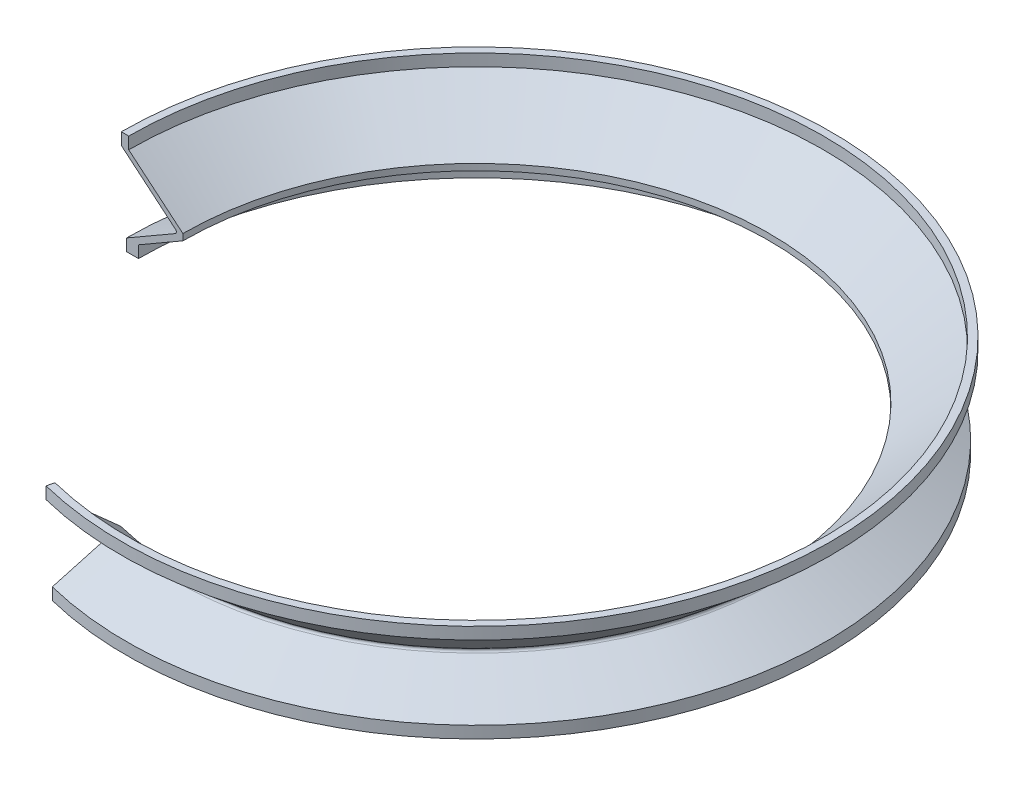
ISO-10303-21;
HEADER;
FILE_DESCRIPTION(('STEP AP214'),'2;1');
FILE_NAME('part.step','',(''),(''),'','','');
FILE_SCHEMA(('AUTOMOTIVE_DESIGN { 1 0 10303 214 1 1 1 1 }'));
ENDSEC;
DATA;
#1=APPLICATION_CONTEXT('core data for automotive mechanical design processes');
#2=APPLICATION_PROTOCOL_DEFINITION('international standard','automotive_design',2000,#1);
#3=PRODUCT_CONTEXT('',#1,'mechanical');
#4=PRODUCT('Part','Part','',(#3));
#5=PRODUCT_RELATED_PRODUCT_CATEGORY('part','',(#4));
#6=PRODUCT_DEFINITION_FORMATION('','',#4);
#7=PRODUCT_DEFINITION_CONTEXT('part definition',#1,'design');
#8=PRODUCT_DEFINITION('design','',#6,#7);
#9=PRODUCT_DEFINITION_SHAPE('','',#8);
#10=(LENGTH_UNIT() NAMED_UNIT(*) SI_UNIT(.MILLI.,.METRE.));
#11=(NAMED_UNIT(*) PLANE_ANGLE_UNIT() SI_UNIT($,.RADIAN.));
#12=(NAMED_UNIT(*) SI_UNIT($,.STERADIAN.) SOLID_ANGLE_UNIT());
#13=UNCERTAINTY_MEASURE_WITH_UNIT(LENGTH_MEASURE(1.E-05),#10,'distance_accuracy_value','');
#14=(GEOMETRIC_REPRESENTATION_CONTEXT(3) GLOBAL_UNCERTAINTY_ASSIGNED_CONTEXT((#13)) GLOBAL_UNIT_ASSIGNED_CONTEXT((#10,
#11,#12)) REPRESENTATION_CONTEXT('',''));
#15=CARTESIAN_POINT('',(0.,0.,0.));
#16=DIRECTION('',(0.,0.,1.));
#17=DIRECTION('',(1.,0.,0.));
#18=AXIS2_PLACEMENT_3D('',#15,#16,#17);
#19=CARTESIAN_POINT('',(50.6987532118802,0.,0.));
#20=DIRECTION('',(0.,-1.,0.));
#21=DIRECTION('',(0.,0.,-1.));
#22=AXIS2_PLACEMENT_3D('',#19,#20,#21);
#23=CONICAL_SURFACE('',#22,50.0359712592462,1.0471975511966);
#24=DIRECTION('',(-0.866025403784442,-0.499999999999995,0.));
#25=VECTOR('',#24,1.);
#26=CARTESIAN_POINT('',(0.662781952633966,0.,0.));
#27=LINE('',#26,#25);
#28=CARTESIAN_POINT('',(0.168056970952835,-0.28562960134843,0.));
#29=VERTEX_POINT('',#28);
#30=CARTESIAN_POINT('',(-7.99747208521054,-5.,0.));
#31=VERTEX_POINT('',#30);
#32=EDGE_CURVE('E191',#29,#31,#27,.T.);
#33=ORIENTED_EDGE('',*,*,#32,.F.);
#34=CARTESIAN_POINT('',(50.6987532118802,-0.285629601348425,0.));
#35=DIRECTION('',(0.,-1.,0.));
#36=DIRECTION('',(0.,0.,-1.));
#37=AXIS2_PLACEMENT_3D('',#34,#35,#36);
#38=CIRCLE('',#37,50.5306962409273);
#39=CARTESIAN_POINT('',(38.4742713913035,-0.285629601348429,49.0297186083222));
#40=VERTEX_POINT('',#39);
#41=EDGE_CURVE('E67',#29,#40,#38,.T.);
#42=ORIENTED_EDGE('',*,*,#41,.T.);
#43=DIRECTION('',(-0.209510507321009,-0.499999999999995,0.840300748138485));
#44=VECTOR('',#43,1.);
#45=CARTESIAN_POINT('',(38.5939561966723,0.,48.549689072915));
#46=LINE('',#45,#44);
#47=CARTESIAN_POINT('',(36.4988511234622,-5.,56.9526965543));
#48=VERTEX_POINT('',#47);
#49=EDGE_CURVE('E209',#40,#48,#46,.T.);
#50=ORIENTED_EDGE('',*,*,#49,.T.);
#51=CARTESIAN_POINT('',(50.6987532118802,-5.,0.));
#52=DIRECTION('',(0.,1.,0.));
#53=DIRECTION('',(0.,0.,1.));
#54=AXIS2_PLACEMENT_3D('',#51,#52,#53);
#55=CIRCLE('',#54,58.6962252970907);
#56=EDGE_CURVE('E158',#48,#31,#55,.T.);
#57=ORIENTED_EDGE('',*,*,#56,.T.);
#58=EDGE_LOOP('',(#33,#42,#50,#57));
#59=FACE_BOUND('',#58,.T.);
#60=ADVANCED_FACE('F45',(#59),#23,.T.);
#61=CARTESIAN_POINT('',(50.6987532118802,8.,0.));
#62=DIRECTION('',(0.,1.,0.));
#63=DIRECTION('',(0.,0.,1.));
#64=AXIS2_PLACEMENT_3D('',#61,#62,#63);
#65=CONICAL_SURFACE('',#64,59.57,0.87266462599717);
#66=DIRECTION('',(0.185322923792944,-0.642787609686535,-0.743289649295822));
#67=VECTOR('',#66,1.);
#68=CARTESIAN_POINT('',(38.5939561966723,0.,48.549689072915));
#69=LINE('',#68,#67);
#70=CARTESIAN_POINT('',(36.2874658910073,8.,57.8005164142609));
#71=VERTEX_POINT('',#70);
#72=CARTESIAN_POINT('',(38.4880887709849,0.367198337412953,48.9743001253446));
#73=VERTEX_POINT('',#72);
#74=EDGE_CURVE('E224',#71,#73,#69,.T.);
#75=ORIENTED_EDGE('',*,*,#74,.T.);
#76=CARTESIAN_POINT('',(50.6987532118802,0.367198337412951,0.));
#77=DIRECTION('',(0.,1.,0.));
#78=DIRECTION('',(0.,0.,1.));
#79=AXIS2_PLACEMENT_3D('',#76,#77,#78);
#80=CIRCLE('',#79,50.4735811970527);
#81=CARTESIAN_POINT('',(0.225172014827455,0.367198337412952,0.));
#82=VERTEX_POINT('',#81);
#83=EDGE_CURVE('E247',#73,#82,#80,.T.);
#84=ORIENTED_EDGE('',*,*,#83,.T.);
#85=DIRECTION('',(0.766044443118982,-0.642787609686535,0.));
#86=VECTOR('',#85,1.);
#87=CARTESIAN_POINT('',(0.662781952633966,0.,0.));
#88=LINE('',#87,#86);
#89=CARTESIAN_POINT('',(-8.87124678811982,8.,0.));
#90=VERTEX_POINT('',#89);
#91=EDGE_CURVE('E206',#90,#82,#88,.T.);
#92=ORIENTED_EDGE('',*,*,#91,.F.);
#93=CARTESIAN_POINT('',(50.6987532118802,8.,0.));
#94=DIRECTION('',(0.,1.,0.));
#95=DIRECTION('',(0.,0.,1.));
#96=AXIS2_PLACEMENT_3D('',#93,#94,#95);
#97=CIRCLE('',#96,59.57);
#98=EDGE_CURVE('E243',#71,#90,#97,.T.);
#99=ORIENTED_EDGE('',*,*,#98,.F.);
#100=EDGE_LOOP('',(#75,#84,#92,#99));
#101=FACE_BOUND('',#100,.T.);
#102=ADVANCED_FACE('F256',(#101),#65,.T.);
#103=CARTESIAN_POINT('',(50.6987532118802,0.373046126524002,0.));
#104=DIRECTION('',(0.,1.,0.));
#105=DIRECTION('',(0.,0.,1.));
#106=AXIS2_PLACEMENT_3D('',#103,#104,#105);
#107=CONICAL_SURFACE('',#106,49.2359712592462,0.87266462599717);
#108=CARTESIAN_POINT('',(50.6987532118802,0.373046126524002,0.));
#109=DIRECTION('',(0.,1.,0.));
#110=DIRECTION('',(0.,0.,1.));
#111=AXIS2_PLACEMENT_3D('',#108,#109,#110);
#112=CIRCLE('',#111,49.2359712592462);
#113=CARTESIAN_POINT('',(38.787493713152,0.373046126524002,47.7734524918942));
#114=VERTEX_POINT('',#113);
#115=CARTESIAN_POINT('',(1.46278195263397,0.373046126524002,0.));
#116=VERTEX_POINT('',#115);
#117=EDGE_CURVE('E236',#114,#116,#112,.T.);
#118=ORIENTED_EDGE('',*,*,#117,.F.);
#119=DIRECTION('',(-0.185322923792944,0.642787609686535,0.743289649295822));
#120=VECTOR('',#119,1.);
#121=CARTESIAN_POINT('',(38.787493713152,0.373046126524002,47.7734524918942));
#122=LINE('',#121,#120);
#123=CARTESIAN_POINT('',(36.5885568167862,8.,56.5929066698862));
#124=VERTEX_POINT('',#123);
#125=EDGE_CURVE('E220',#114,#124,#122,.T.);
#126=ORIENTED_EDGE('',*,*,#125,.T.);
#127=CARTESIAN_POINT('',(50.6987532118802,8.,0.));
#128=DIRECTION('',(0.,1.,0.));
#129=DIRECTION('',(0.,0.,1.));
#130=AXIS2_PLACEMENT_3D('',#127,#128,#129);
#131=CIRCLE('',#130,58.3254209385117);
#132=CARTESIAN_POINT('',(-7.62666772663149,8.,0.));
#133=VERTEX_POINT('',#132);
#134=EDGE_CURVE('E239',#124,#133,#131,.T.);
#135=ORIENTED_EDGE('',*,*,#134,.T.);
#136=DIRECTION('',(-0.766044443118982,0.642787609686535,0.));
#137=VECTOR('',#136,1.);
#138=CARTESIAN_POINT('',(1.46278195263397,0.373046126524002,0.));
#139=LINE('',#138,#137);
#140=EDGE_CURVE('E202',#116,#133,#139,.T.);
#141=ORIENTED_EDGE('',*,*,#140,.F.);
#142=EDGE_LOOP('',(#118,#126,#135,#141));
#143=FACE_BOUND('',#142,.T.);
#144=ADVANCED_FACE('F286',(#143),#107,.F.);
#145=CARTESIAN_POINT('',(50.6987532118802,7.60901803281972,0.));
#146=DIRECTION('',(0.,1.,0.));
#147=DIRECTION('',(0.,0.,1.));
#148=AXIS2_PLACEMENT_3D('',#145,#146,#147);
#149=CYLINDRICAL_SURFACE('',#148,49.2359712592462);
#150=CARTESIAN_POINT('',(50.6987532118802,-0.692820323027554,0.));
#151=DIRECTION('',(0.,1.,0.));
#152=DIRECTION('',(0.,0.,1.));
#153=AXIS2_PLACEMENT_3D('',#150,#151,#152);
#154=CIRCLE('',#153,49.2359712592462);
#155=CARTESIAN_POINT('',(38.787493713152,-0.692820323027553,47.7734524918942));
#156=VERTEX_POINT('',#155);
#157=CARTESIAN_POINT('',(1.46278195263397,-0.692820323027553,0.));
#158=VERTEX_POINT('',#157);
#159=EDGE_CURVE('E233',#156,#158,#154,.T.);
#160=ORIENTED_EDGE('',*,*,#159,.F.);
#161=DIRECTION('',(0.,1.,0.));
#162=VECTOR('',#161,1.);
#163=CARTESIAN_POINT('',(38.787493713152,-0.692820323027553,47.7734524918942));
#164=LINE('',#163,#162);
#165=EDGE_CURVE('E216',#156,#114,#164,.T.);
#166=ORIENTED_EDGE('',*,*,#165,.T.);
#167=ORIENTED_EDGE('',*,*,#117,.T.);
#168=DIRECTION('',(0.,1.,0.));
#169=VECTOR('',#168,1.);
#170=CARTESIAN_POINT('',(1.46278195263397,-0.692820323027553,0.));
#171=LINE('',#170,#169);
#172=EDGE_CURVE('E198',#158,#116,#171,.T.);
#173=ORIENTED_EDGE('',*,*,#172,.F.);
#174=EDGE_LOOP('',(#160,#166,#167,#173));
#175=FACE_BOUND('',#174,.T.);
#176=ADVANCED_FACE('F291',(#175),#149,.F.);
#177=CARTESIAN_POINT('',(50.6987532118802,-5.,0.));
#178=DIRECTION('',(0.,-1.,0.));
#179=DIRECTION('',(0.,0.,-1.));
#180=AXIS2_PLACEMENT_3D('',#177,#178,#179);
#181=CONICAL_SURFACE('',#180,56.6962252970907,1.0471975511966);
#182=CARTESIAN_POINT('',(50.6987532118802,-5.,0.));
#183=DIRECTION('',(0.,1.,0.));
#184=DIRECTION('',(0.,0.,1.));
#185=AXIS2_PLACEMENT_3D('',#182,#183,#184);
#186=CIRCLE('',#185,56.6962252970907);
#187=CARTESIAN_POINT('',(36.9826949146615,-5.,55.012105101748));
#188=VERTEX_POINT('',#187);
#189=CARTESIAN_POINT('',(-5.99747208521052,-5.,0.));
#190=VERTEX_POINT('',#189);
#191=EDGE_CURVE('E230',#188,#190,#186,.T.);
#192=ORIENTED_EDGE('',*,*,#191,.F.);
#193=DIRECTION('',(0.209510507321009,0.499999999999995,-0.840300748138486));
#194=VECTOR('',#193,1.);
#195=CARTESIAN_POINT('',(38.787493713152,-0.692820323027553,47.7734524918942));
#196=LINE('',#195,#194);
#197=EDGE_CURVE('E212',#188,#156,#196,.T.);
#198=ORIENTED_EDGE('',*,*,#197,.T.);
#199=ORIENTED_EDGE('',*,*,#159,.T.);
#200=DIRECTION('',(0.866025403784442,0.499999999999995,0.));
#201=VECTOR('',#200,1.);
#202=CARTESIAN_POINT('',(1.46278195263397,-0.692820323027553,0.));
#203=LINE('',#202,#201);
#204=EDGE_CURVE('E194',#190,#158,#203,.T.);
#205=ORIENTED_EDGE('',*,*,#204,.F.);
#206=EDGE_LOOP('',(#192,#198,#199,#205));
#207=FACE_BOUND('',#206,.T.);
#208=ADVANCED_FACE('F289',(#207),#181,.F.);
#209=CARTESIAN_POINT('',(38.4336147303218,0.,49.1927835690086));
#210=DIRECTION('',(-0.970295726275994,0.,-0.241921895599679));
#211=DIRECTION('',(-0.241921895599679,0.,0.970295726275994));
#212=AXIS2_PLACEMENT_3D('',#209,#210,#211);
#213=PLANE('',#212);
#214=ORIENTED_EDGE('',*,*,#49,.F.);
#215=CARTESIAN_POINT('',(38.4258870121835,0.0607805601653541,49.2237777535774));
#216=DIRECTION('',(-0.970295726275994,0.,-0.241921895599679));
#217=DIRECTION('',(-0.241921895599679,0.,0.970295726275994));
#218=AXIS2_PLACEMENT_3D('',#215,#216,#217);
#219=CIRCLE('',#218,0.4);
#220=EDGE_CURVE('E11',#40,#73,#219,.F.);
#221=ORIENTED_EDGE('',*,*,#220,.T.);
#222=ORIENTED_EDGE('',*,*,#74,.F.);
#223=DIRECTION('',(0.,-1.,0.));
#224=VECTOR('',#223,1.);
#225=CARTESIAN_POINT('',(36.2874658910073,10.,57.8005164142609));
#226=LINE('',#225,#224);
#227=CARTESIAN_POINT('',(36.2874658910073,10.,57.8005164142609));
#228=VERTEX_POINT('',#227);
#229=EDGE_CURVE('E185',#228,#71,#226,.T.);
#230=ORIENTED_EDGE('',*,*,#229,.F.);
#231=DIRECTION('',(-0.241921895599676,0.,0.970295726275994));
#232=VECTOR('',#231,1.);
#233=CARTESIAN_POINT('',(36.5885568167862,10.,56.5929066698862));
#234=LINE('',#233,#232);
#235=CARTESIAN_POINT('',(36.5885568167862,10.,56.5929066698862));
#236=VERTEX_POINT('',#235);
#237=EDGE_CURVE('E165',#236,#228,#234,.T.);
#238=ORIENTED_EDGE('',*,*,#237,.F.);
#239=DIRECTION('',(0.,-1.,0.));
#240=VECTOR('',#239,1.);
#241=CARTESIAN_POINT('',(36.5885568167862,10.,56.5929066698862));
#242=LINE('',#241,#240);
#243=EDGE_CURVE('E188',#236,#124,#242,.T.);
#244=ORIENTED_EDGE('',*,*,#243,.T.);
#245=ORIENTED_EDGE('',*,*,#125,.F.);
#246=ORIENTED_EDGE('',*,*,#165,.F.);
#247=ORIENTED_EDGE('',*,*,#197,.F.);
#248=DIRECTION('',(0.,1.,0.));
#249=VECTOR('',#248,1.);
#250=CARTESIAN_POINT('',(36.9826949146615,-6.99999999999999,55.012105101748));
#251=LINE('',#250,#249);
#252=CARTESIAN_POINT('',(36.9826949146615,-6.99999999999999,55.012105101748));
#253=VERTEX_POINT('',#252);
#254=EDGE_CURVE('E141',#253,#188,#251,.T.);
#255=ORIENTED_EDGE('',*,*,#254,.F.);
#256=DIRECTION('',(0.241921895599681,0.,-0.970295726275993));
#257=VECTOR('',#256,1.);
#258=CARTESIAN_POINT('',(36.4988511234622,-6.99999999999999,56.9526965543));
#259=LINE('',#258,#257);
#260=CARTESIAN_POINT('',(36.4988511234622,-6.99999999999999,56.9526965543));
#261=VERTEX_POINT('',#260);
#262=EDGE_CURVE('E134',#261,#253,#259,.T.);
#263=ORIENTED_EDGE('',*,*,#262,.F.);
#264=DIRECTION('',(0.,1.,0.));
#265=VECTOR('',#264,1.);
#266=CARTESIAN_POINT('',(36.4988511234622,-6.99999999999999,56.9526965543));
#267=LINE('',#266,#265);
#268=EDGE_CURVE('E138',#261,#48,#267,.T.);
#269=ORIENTED_EDGE('',*,*,#268,.T.);
#270=EDGE_LOOP('',(#214,#221,#222,#230,#238,#244,#245,#246,#247,#255,#263,#269));
#271=FACE_BOUND('',#270,.T.);
#272=ADVANCED_FACE('F136',(#271),#213,.T.);
#273=CARTESIAN_POINT('',(0.,0.,0.));
#274=DIRECTION('',(0.,0.,-1.));
#275=DIRECTION('',(-1.,0.,0.));
#276=AXIS2_PLACEMENT_3D('',#273,#274,#275);
#277=PLANE('',#276);
#278=ORIENTED_EDGE('',*,*,#91,.T.);
#279=CARTESIAN_POINT('',(-0.031943029047167,0.0607805601653541,0.));
#280=DIRECTION('',(0.,0.,-1.));
#281=DIRECTION('',(-1.,0.,0.));
#282=AXIS2_PLACEMENT_3D('',#279,#280,#281);
#283=CIRCLE('',#282,0.4);
#284=EDGE_CURVE('E54',#82,#29,#283,.T.);
#285=ORIENTED_EDGE('',*,*,#284,.T.);
#286=ORIENTED_EDGE('',*,*,#32,.T.);
#287=DIRECTION('',(0.,1.,0.));
#288=VECTOR('',#287,1.);
#289=CARTESIAN_POINT('',(-7.99747208521054,-7.,0.));
#290=LINE('',#289,#288);
#291=CARTESIAN_POINT('',(-7.99747208521054,-7.,0.));
#292=VERTEX_POINT('',#291);
#293=EDGE_CURVE('E315',#292,#31,#290,.T.);
#294=ORIENTED_EDGE('',*,*,#293,.F.);
#295=DIRECTION('',(-1.,0.,0.));
#296=VECTOR('',#295,1.);
#297=CARTESIAN_POINT('',(-7.99747208521054,-7.,0.));
#298=LINE('',#297,#296);
#299=CARTESIAN_POINT('',(-5.99747208521052,-7.,0.));
#300=VERTEX_POINT('',#299);
#301=EDGE_CURVE('E151',#300,#292,#298,.T.);
#302=ORIENTED_EDGE('',*,*,#301,.F.);
#303=DIRECTION('',(0.,1.,0.));
#304=VECTOR('',#303,1.);
#305=CARTESIAN_POINT('',(-5.99747208521052,-7.,0.));
#306=LINE('',#305,#304);
#307=EDGE_CURVE('E167',#300,#190,#306,.T.);
#308=ORIENTED_EDGE('',*,*,#307,.T.);
#309=ORIENTED_EDGE('',*,*,#204,.T.);
#310=ORIENTED_EDGE('',*,*,#172,.T.);
#311=ORIENTED_EDGE('',*,*,#140,.T.);
#312=DIRECTION('',(0.,-1.,0.));
#313=VECTOR('',#312,1.);
#314=CARTESIAN_POINT('',(-7.62666772663149,9.99999999999999,0.));
#315=LINE('',#314,#313);
#316=CARTESIAN_POINT('',(-7.62666772663149,9.99999999999999,0.));
#317=VERTEX_POINT('',#316);
#318=EDGE_CURVE('E179',#317,#133,#315,.T.);
#319=ORIENTED_EDGE('',*,*,#318,.F.);
#320=DIRECTION('',(1.,0.,0.));
#321=VECTOR('',#320,1.);
#322=CARTESIAN_POINT('',(-7.62666772663149,9.99999999999999,0.));
#323=LINE('',#322,#321);
#324=CARTESIAN_POINT('',(-8.87124678811983,9.99999999999999,0.));
#325=VERTEX_POINT('',#324);
#326=EDGE_CURVE('E176',#325,#317,#323,.T.);
#327=ORIENTED_EDGE('',*,*,#326,.F.);
#328=DIRECTION('',(0.,-1.,0.));
#329=VECTOR('',#328,1.);
#330=CARTESIAN_POINT('',(-8.87124678811983,9.99999999999999,0.));
#331=LINE('',#330,#329);
#332=EDGE_CURVE('E182',#325,#90,#331,.T.);
#333=ORIENTED_EDGE('',*,*,#332,.T.);
#334=EDGE_LOOP('',(#278,#285,#286,#294,#302,#308,#309,#310,#311,#319,#327,#333));
#335=FACE_BOUND('',#334,.T.);
#336=ADVANCED_FACE('F261',(#335),#277,.F.);
#337=CARTESIAN_POINT('',(50.6987532118802,0.0607805601653541,0.));
#338=DIRECTION('',(0.,1.,0.));
#339=DIRECTION('',(0.,0.,1.));
#340=AXIS2_PLACEMENT_3D('',#337,#338,#339);
#341=TOROIDAL_SURFACE('',#340,50.7306962409273,0.4);
#342=ORIENTED_EDGE('',*,*,#220,.F.);
#343=ORIENTED_EDGE('',*,*,#41,.F.);
#344=ORIENTED_EDGE('',*,*,#284,.F.);
#345=ORIENTED_EDGE('',*,*,#83,.F.);
#346=EDGE_LOOP('',(#342,#343,#344,#345));
#347=FACE_BOUND('',#346,.T.);
#348=ADVANCED_FACE('F47',(#347),#341,.F.);
#349=CARTESIAN_POINT('',(50.6987532118802,10.,0.));
#350=DIRECTION('',(0.,-1.,0.));
#351=DIRECTION('',(1.,0.,0.));
#352=AXIS2_PLACEMENT_3D('',#349,#350,#351);
#353=CYLINDRICAL_SURFACE('',#352,58.3254209385117);
#354=ORIENTED_EDGE('',*,*,#134,.F.);
#355=ORIENTED_EDGE('',*,*,#243,.F.);
#356=CARTESIAN_POINT('',(50.6987532118802,10.,0.));
#357=DIRECTION('',(0.,-1.,0.));
#358=DIRECTION('',(-1.,0.,0.));
#359=AXIS2_PLACEMENT_3D('',#356,#357,#358);
#360=CIRCLE('',#359,58.3254209385117);
#361=EDGE_CURVE('E160',#317,#236,#360,.T.);
#362=ORIENTED_EDGE('',*,*,#361,.F.);
#363=ORIENTED_EDGE('',*,*,#318,.T.);
#364=EDGE_LOOP('',(#354,#355,#362,#363));
#365=FACE_BOUND('',#364,.T.);
#366=ADVANCED_FACE('F270',(#365),#353,.F.);
#367=CARTESIAN_POINT('',(50.6987532118802,10.,0.));
#368=DIRECTION('',(0.,-1.,0.));
#369=DIRECTION('',(1.,0.,0.));
#370=AXIS2_PLACEMENT_3D('',#367,#368,#369);
#371=CYLINDRICAL_SURFACE('',#370,59.57);
#372=ORIENTED_EDGE('',*,*,#98,.T.);
#373=ORIENTED_EDGE('',*,*,#332,.F.);
#374=CARTESIAN_POINT('',(50.6987532118802,10.,0.));
#375=DIRECTION('',(0.,1.,0.));
#376=DIRECTION('',(-1.,0.,0.));
#377=AXIS2_PLACEMENT_3D('',#374,#375,#376);
#378=CIRCLE('',#377,59.57);
#379=EDGE_CURVE('E173',#228,#325,#378,.T.);
#380=ORIENTED_EDGE('',*,*,#379,.F.);
#381=ORIENTED_EDGE('',*,*,#229,.T.);
#382=EDGE_LOOP('',(#372,#373,#380,#381));
#383=FACE_BOUND('',#382,.T.);
#384=ADVANCED_FACE('F267',(#383),#371,.T.);
#385=CARTESIAN_POINT('',(50.6987532118802,10.,0.));
#386=DIRECTION('',(0.,1.,0.));
#387=DIRECTION('',(-1.,0.,0.));
#388=AXIS2_PLACEMENT_3D('',#385,#386,#387);
#389=PLANE('',#388);
#390=ORIENTED_EDGE('',*,*,#361,.T.);
#391=ORIENTED_EDGE('',*,*,#237,.T.);
#392=ORIENTED_EDGE('',*,*,#379,.T.);
#393=ORIENTED_EDGE('',*,*,#326,.T.);
#394=EDGE_LOOP('',(#390,#391,#392,#393));
#395=FACE_BOUND('',#394,.T.);
#396=ADVANCED_FACE('F327',(#395),#389,.T.);
#397=CARTESIAN_POINT('',(50.6987532118802,-6.99999999999999,0.));
#398=DIRECTION('',(0.,1.,0.));
#399=DIRECTION('',(-1.,0.,0.));
#400=AXIS2_PLACEMENT_3D('',#397,#398,#399);
#401=CYLINDRICAL_SURFACE('',#400,58.6962252970907);
#402=ORIENTED_EDGE('',*,*,#56,.F.);
#403=ORIENTED_EDGE('',*,*,#268,.F.);
#404=CARTESIAN_POINT('',(50.6987532118802,-6.99999999999999,0.));
#405=DIRECTION('',(0.,-1.,0.));
#406=DIRECTION('',(1.,0.,0.));
#407=AXIS2_PLACEMENT_3D('',#404,#405,#406);
#408=CIRCLE('',#407,58.6962252970907);
#409=EDGE_CURVE('E146',#292,#261,#408,.T.);
#410=ORIENTED_EDGE('',*,*,#409,.F.);
#411=ORIENTED_EDGE('',*,*,#293,.T.);
#412=EDGE_LOOP('',(#402,#403,#410,#411));
#413=FACE_BOUND('',#412,.T.);
#414=ADVANCED_FACE('F156',(#413),#401,.T.);
#415=CARTESIAN_POINT('',(50.6987532118802,-6.99999999999999,0.));
#416=DIRECTION('',(0.,1.,0.));
#417=DIRECTION('',(-1.,0.,0.));
#418=AXIS2_PLACEMENT_3D('',#415,#416,#417);
#419=CYLINDRICAL_SURFACE('',#418,56.6962252970907);
#420=ORIENTED_EDGE('',*,*,#191,.T.);
#421=ORIENTED_EDGE('',*,*,#307,.F.);
#422=CARTESIAN_POINT('',(50.6987532118802,-6.99999999999999,0.));
#423=DIRECTION('',(0.,1.,0.));
#424=DIRECTION('',(1.,0.,0.));
#425=AXIS2_PLACEMENT_3D('',#422,#423,#424);
#426=CIRCLE('',#425,56.6962252970907);
#427=EDGE_CURVE('E145',#253,#300,#426,.T.);
#428=ORIENTED_EDGE('',*,*,#427,.F.);
#429=ORIENTED_EDGE('',*,*,#254,.T.);
#430=EDGE_LOOP('',(#420,#421,#428,#429));
#431=FACE_BOUND('',#430,.T.);
#432=ADVANCED_FACE('F311',(#431),#419,.F.);
#433=CARTESIAN_POINT('',(50.6987532118802,-6.99999999999999,0.));
#434=DIRECTION('',(0.,-1.,0.));
#435=DIRECTION('',(1.,0.,0.));
#436=AXIS2_PLACEMENT_3D('',#433,#434,#435);
#437=PLANE('',#436);
#438=ORIENTED_EDGE('',*,*,#409,.T.);
#439=ORIENTED_EDGE('',*,*,#262,.T.);
#440=ORIENTED_EDGE('',*,*,#427,.T.);
#441=ORIENTED_EDGE('',*,*,#301,.T.);
#442=EDGE_LOOP('',(#438,#439,#440,#441));
#443=FACE_BOUND('',#442,.T.);
#444=ADVANCED_FACE('F149',(#443),#437,.T.);
#445=CLOSED_SHELL('',(#60,#102,#144,#176,#208,#272,#336,#348,#366,#384,#396,#414,#432,#444));
#446=MANIFOLD_SOLID_BREP('B2',#445);
#447=ADVANCED_BREP_SHAPE_REPRESENTATION('',(#18,#446),#14);
#448=SHAPE_DEFINITION_REPRESENTATION(#9,#447);
ENDSEC;
END-ISO-10303-21;
